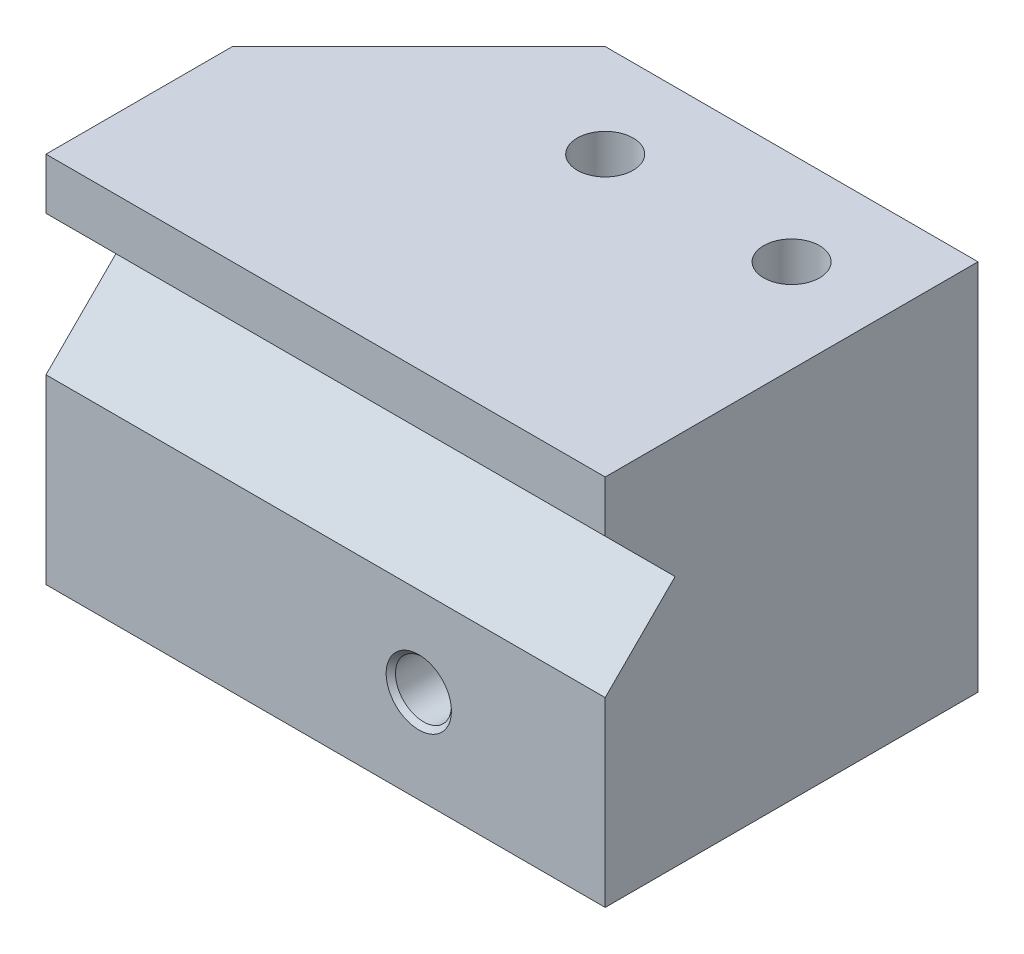
ISO-10303-21;
HEADER;
FILE_DESCRIPTION(('STEP AP214'),'2;1');
FILE_NAME('part.step','',(''),(''),'','','');
FILE_SCHEMA(('AUTOMOTIVE_DESIGN { 1 0 10303 214 1 1 1 1 }'));
ENDSEC;
DATA;
#1=APPLICATION_CONTEXT('core data for automotive mechanical design processes');
#2=APPLICATION_PROTOCOL_DEFINITION('international standard','automotive_design',2000,#1);
#3=PRODUCT_CONTEXT('',#1,'mechanical');
#4=PRODUCT('Part','Part','',(#3));
#5=PRODUCT_RELATED_PRODUCT_CATEGORY('part','',(#4));
#6=PRODUCT_DEFINITION_FORMATION('','',#4);
#7=PRODUCT_DEFINITION_CONTEXT('part definition',#1,'design');
#8=PRODUCT_DEFINITION('design','',#6,#7);
#9=PRODUCT_DEFINITION_SHAPE('','',#8);
#10=(LENGTH_UNIT() NAMED_UNIT(*) SI_UNIT(.MILLI.,.METRE.));
#11=(NAMED_UNIT(*) PLANE_ANGLE_UNIT() SI_UNIT($,.RADIAN.));
#12=(NAMED_UNIT(*) SI_UNIT($,.STERADIAN.) SOLID_ANGLE_UNIT());
#13=UNCERTAINTY_MEASURE_WITH_UNIT(LENGTH_MEASURE(1.E-05),#10,'distance_accuracy_value','');
#14=(GEOMETRIC_REPRESENTATION_CONTEXT(3) GLOBAL_UNCERTAINTY_ASSIGNED_CONTEXT((#13)) GLOBAL_UNIT_ASSIGNED_CONTEXT((#10,
#11,#12)) REPRESENTATION_CONTEXT('',''));
#15=CARTESIAN_POINT('',(0.,0.,0.));
#16=DIRECTION('',(0.,0.,1.));
#17=DIRECTION('',(1.,0.,0.));
#18=AXIS2_PLACEMENT_3D('',#15,#16,#17);
#19=CARTESIAN_POINT('',(15.,-10.,20.));
#20=DIRECTION('',(-1.,0.,0.));
#21=DIRECTION('',(0.,0.,1.));
#22=AXIS2_PLACEMENT_3D('',#19,#20,#21);
#23=PLANE('',#22);
#24=DIRECTION('',(0.,0.707106781186548,0.707106781186548));
#25=VECTOR('',#24,1.);
#26=CARTESIAN_POINT('',(15.,-1.375,11.375));
#27=LINE('',#26,#25);
#28=CARTESIAN_POINT('',(15.,3.5,16.25));
#29=VERTEX_POINT('',#28);
#30=CARTESIAN_POINT('',(15.,7.25,20.));
#31=VERTEX_POINT('',#30);
#32=EDGE_CURVE('E111',#29,#31,#27,.T.);
#33=ORIENTED_EDGE('',*,*,#32,.F.);
#34=DIRECTION('',(0.,0.707106781186548,-0.707106781186548));
#35=VECTOR('',#34,1.);
#36=CARTESIAN_POINT('',(15.,-5.125,24.875));
#37=LINE('',#36,#35);
#38=CARTESIAN_POINT('',(15.,-0.250000000000002,20.));
#39=VERTEX_POINT('',#38);
#40=EDGE_CURVE('E108',#39,#29,#37,.T.);
#41=ORIENTED_EDGE('',*,*,#40,.F.);
#42=DIRECTION('',(0.,1.,0.));
#43=VECTOR('',#42,1.);
#44=CARTESIAN_POINT('',(15.,-10.,20.));
#45=LINE('',#44,#43);
#46=CARTESIAN_POINT('',(15.,-10.,20.));
#47=VERTEX_POINT('',#46);
#48=EDGE_CURVE('E93',#47,#39,#45,.T.);
#49=ORIENTED_EDGE('',*,*,#48,.F.);
#50=DIRECTION('',(0.,0.,-1.));
#51=VECTOR('',#50,1.);
#52=CARTESIAN_POINT('',(15.,-10.,20.));
#53=LINE('',#52,#51);
#54=CARTESIAN_POINT('',(15.,-10.,0.));
#55=VERTEX_POINT('',#54);
#56=EDGE_CURVE('E144',#47,#55,#53,.T.);
#57=ORIENTED_EDGE('',*,*,#56,.T.);
#58=DIRECTION('',(0.,1.,0.));
#59=VECTOR('',#58,1.);
#60=CARTESIAN_POINT('',(15.,-10.,0.));
#61=LINE('',#60,#59);
#62=CARTESIAN_POINT('',(15.,10.,0.));
#63=VERTEX_POINT('',#62);
#64=EDGE_CURVE('E152',#55,#63,#61,.T.);
#65=ORIENTED_EDGE('',*,*,#64,.T.);
#66=DIRECTION('',(0.,0.,-1.));
#67=VECTOR('',#66,1.);
#68=CARTESIAN_POINT('',(15.,10.,20.));
#69=LINE('',#68,#67);
#70=CARTESIAN_POINT('',(15.,10.,20.));
#71=VERTEX_POINT('',#70);
#72=EDGE_CURVE('E121',#71,#63,#69,.T.);
#73=ORIENTED_EDGE('',*,*,#72,.F.);
#74=EDGE_CURVE('E105',#31,#71,#45,.T.);
#75=ORIENTED_EDGE('',*,*,#74,.F.);
#76=EDGE_LOOP('',(#33,#41,#49,#57,#65,#73,#75));
#77=FACE_BOUND('',#76,.T.);
#78=ADVANCED_FACE('F31',(#77),#23,.F.);
#79=CARTESIAN_POINT('',(-15.,-10.,20.));
#80=DIRECTION('',(1.,0.,0.));
#81=DIRECTION('',(0.,0.,-1.));
#82=AXIS2_PLACEMENT_3D('',#79,#80,#81);
#83=PLANE('',#82);
#84=DIRECTION('',(0.,0.,-1.));
#85=VECTOR('',#84,1.);
#86=CARTESIAN_POINT('',(-15.,10.,20.));
#87=LINE('',#86,#85);
#88=CARTESIAN_POINT('',(-15.,10.,20.));
#89=VERTEX_POINT('',#88);
#90=CARTESIAN_POINT('',(-15.,10.,9.99999999999999));
#91=VERTEX_POINT('',#90);
#92=EDGE_CURVE('E127',#89,#91,#87,.T.);
#93=ORIENTED_EDGE('',*,*,#92,.T.);
#94=DIRECTION('',(0.,-1.,0.));
#95=VECTOR('',#94,1.);
#96=CARTESIAN_POINT('',(-15.,-10.,9.99999999999999));
#97=LINE('',#96,#95);
#98=CARTESIAN_POINT('',(-15.,-10.,9.99999999999999));
#99=VERTEX_POINT('',#98);
#100=EDGE_CURVE('E124',#91,#99,#97,.T.);
#101=ORIENTED_EDGE('',*,*,#100,.T.);
#102=DIRECTION('',(0.,0.,-1.));
#103=VECTOR('',#102,1.);
#104=CARTESIAN_POINT('',(-15.,-10.,20.));
#105=LINE('',#104,#103);
#106=CARTESIAN_POINT('',(-15.,-10.,20.));
#107=VERTEX_POINT('',#106);
#108=EDGE_CURVE('E138',#107,#99,#105,.T.);
#109=ORIENTED_EDGE('',*,*,#108,.F.);
#110=DIRECTION('',(0.,-1.,0.));
#111=VECTOR('',#110,1.);
#112=CARTESIAN_POINT('',(-15.,-10.,20.));
#113=LINE('',#112,#111);
#114=CARTESIAN_POINT('',(-15.,-0.250000000000002,20.));
#115=VERTEX_POINT('',#114);
#116=EDGE_CURVE('E159',#115,#107,#113,.T.);
#117=ORIENTED_EDGE('',*,*,#116,.F.);
#118=DIRECTION('',(0.,-0.707106781186548,0.707106781186548));
#119=VECTOR('',#118,1.);
#120=CARTESIAN_POINT('',(-15.,-5.125,24.875));
#121=LINE('',#120,#119);
#122=CARTESIAN_POINT('',(-15.,3.5,16.25));
#123=VERTEX_POINT('',#122);
#124=EDGE_CURVE('E116',#123,#115,#121,.T.);
#125=ORIENTED_EDGE('',*,*,#124,.F.);
#126=DIRECTION('',(0.,-0.707106781186548,-0.707106781186548));
#127=VECTOR('',#126,1.);
#128=CARTESIAN_POINT('',(-15.,-1.375,11.375));
#129=LINE('',#128,#127);
#130=CARTESIAN_POINT('',(-15.,7.25,20.));
#131=VERTEX_POINT('',#130);
#132=EDGE_CURVE('E115',#131,#123,#129,.T.);
#133=ORIENTED_EDGE('',*,*,#132,.F.);
#134=EDGE_CURVE('E156',#89,#131,#113,.T.);
#135=ORIENTED_EDGE('',*,*,#134,.F.);
#136=EDGE_LOOP('',(#93,#101,#109,#117,#125,#133,#135));
#137=FACE_BOUND('',#136,.T.);
#138=ADVANCED_FACE('F137',(#137),#83,.F.);
#139=CARTESIAN_POINT('',(15.,10.,20.));
#140=DIRECTION('',(0.,0.,-1.));
#141=DIRECTION('',(-1.,0.,0.));
#142=AXIS2_PLACEMENT_3D('',#139,#140,#141);
#143=PLANE('',#142);
#144=DIRECTION('',(-1.,0.,0.));
#145=VECTOR('',#144,1.);
#146=CARTESIAN_POINT('',(15.,7.25,20.));
#147=LINE('',#146,#145);
#148=EDGE_CURVE('E120',#31,#131,#147,.T.);
#149=ORIENTED_EDGE('',*,*,#148,.F.);
#150=ORIENTED_EDGE('',*,*,#74,.T.);
#151=DIRECTION('',(-1.,0.,0.));
#152=VECTOR('',#151,1.);
#153=CARTESIAN_POINT('',(-15.,10.,20.));
#154=LINE('',#153,#152);
#155=EDGE_CURVE('E104',#71,#89,#154,.T.);
#156=ORIENTED_EDGE('',*,*,#155,.T.);
#157=ORIENTED_EDGE('',*,*,#134,.T.);
#158=EDGE_LOOP('',(#149,#150,#156,#157));
#159=FACE_BOUND('',#158,.T.);
#160=ADVANCED_FACE('F196',(#159),#143,.F.);
#161=CARTESIAN_POINT('',(5.,-5.,20.));
#162=DIRECTION('',(0.,0.,1.));
#163=DIRECTION('',(1.,0.,0.));
#164=AXIS2_PLACEMENT_3D('',#161,#162,#163);
#165=CIRCLE('',#164,1.75);
#166=CARTESIAN_POINT('',(6.75,-5.,20.));
#167=VERTEX_POINT('',#166);
#168=EDGE_CURVE('E188',#167,#167,#165,.T.);
#169=ORIENTED_EDGE('',*,*,#168,.F.);
#170=EDGE_LOOP('',(#169));
#171=FACE_BOUND('',#170,.T.);
#172=DIRECTION('',(1.,0.,0.));
#173=VECTOR('',#172,1.);
#174=CARTESIAN_POINT('',(15.,-0.250000000000002,20.));
#175=LINE('',#174,#173);
#176=EDGE_CURVE('E97',#115,#39,#175,.T.);
#177=ORIENTED_EDGE('',*,*,#176,.F.);
#178=ORIENTED_EDGE('',*,*,#116,.T.);
#179=DIRECTION('',(1.,0.,0.));
#180=VECTOR('',#179,1.);
#181=CARTESIAN_POINT('',(-15.,-10.,20.));
#182=LINE('',#181,#180);
#183=EDGE_CURVE('E100',#107,#47,#182,.T.);
#184=ORIENTED_EDGE('',*,*,#183,.T.);
#185=ORIENTED_EDGE('',*,*,#48,.T.);
#186=EDGE_LOOP('',(#177,#178,#184,#185));
#187=FACE_BOUND('',#186,.T.);
#188=ADVANCED_FACE('F95',(#171,#187),#143,.F.);
#189=CARTESIAN_POINT('',(-15.,10.,20.));
#190=DIRECTION('',(0.,-1.,0.));
#191=DIRECTION('',(0.,0.,-1.));
#192=AXIS2_PLACEMENT_3D('',#189,#190,#191);
#193=PLANE('',#192);
#194=CARTESIAN_POINT('',(0.,10.,5.));
#195=DIRECTION('',(0.,1.,0.));
#196=DIRECTION('',(0.,0.,1.));
#197=AXIS2_PLACEMENT_3D('',#194,#195,#196);
#198=CIRCLE('',#197,1.5);
#199=CARTESIAN_POINT('',(0.,10.,6.5));
#200=VERTEX_POINT('',#199);
#201=EDGE_CURVE('E174',#200,#200,#198,.T.);
#202=ORIENTED_EDGE('',*,*,#201,.F.);
#203=EDGE_LOOP('',(#202));
#204=FACE_BOUND('',#203,.T.);
#205=CARTESIAN_POINT('',(10.,10.,5.));
#206=DIRECTION('',(0.,1.,0.));
#207=DIRECTION('',(0.,0.,1.));
#208=AXIS2_PLACEMENT_3D('',#205,#206,#207);
#209=CIRCLE('',#208,1.5);
#210=CARTESIAN_POINT('',(10.,10.,6.5));
#211=VERTEX_POINT('',#210);
#212=EDGE_CURVE('E168',#211,#211,#209,.T.);
#213=ORIENTED_EDGE('',*,*,#212,.F.);
#214=EDGE_LOOP('',(#213));
#215=FACE_BOUND('',#214,.T.);
#216=DIRECTION('',(-1.,0.,0.));
#217=VECTOR('',#216,1.);
#218=CARTESIAN_POINT('',(-15.,10.,0.));
#219=LINE('',#218,#217);
#220=CARTESIAN_POINT('',(-4.99999999999996,10.,0.));
#221=VERTEX_POINT('',#220);
#222=EDGE_CURVE('E150',#63,#221,#219,.T.);
#223=ORIENTED_EDGE('',*,*,#222,.T.);
#224=DIRECTION('',(-0.707106781186549,0.,0.707106781186546));
#225=VECTOR('',#224,1.);
#226=CARTESIAN_POINT('',(-15.,10.,9.99999999999999));
#227=LINE('',#226,#225);
#228=EDGE_CURVE('E11',#221,#91,#227,.T.);
#229=ORIENTED_EDGE('',*,*,#228,.T.);
#230=ORIENTED_EDGE('',*,*,#92,.F.);
#231=ORIENTED_EDGE('',*,*,#155,.F.);
#232=ORIENTED_EDGE('',*,*,#72,.T.);
#233=EDGE_LOOP('',(#223,#229,#230,#231,#232));
#234=FACE_BOUND('',#233,.T.);
#235=ADVANCED_FACE('F195',(#204,#215,#234),#193,.F.);
#236=CARTESIAN_POINT('',(-15.,-10.,20.));
#237=DIRECTION('',(0.,1.,0.));
#238=DIRECTION('',(0.,0.,1.));
#239=AXIS2_PLACEMENT_3D('',#236,#237,#238);
#240=PLANE('',#239);
#241=CARTESIAN_POINT('',(0.,-10.,5.));
#242=DIRECTION('',(0.,1.,0.));
#243=DIRECTION('',(0.,0.,1.));
#244=AXIS2_PLACEMENT_3D('',#241,#242,#243);
#245=CIRCLE('',#244,1.5);
#246=CARTESIAN_POINT('',(0.,-10.,6.5));
#247=VERTEX_POINT('',#246);
#248=EDGE_CURVE('E171',#247,#247,#245,.T.);
#249=ORIENTED_EDGE('',*,*,#248,.T.);
#250=EDGE_LOOP('',(#249));
#251=FACE_BOUND('',#250,.T.);
#252=CARTESIAN_POINT('',(10.,-10.,5.));
#253=DIRECTION('',(0.,1.,0.));
#254=DIRECTION('',(0.,0.,1.));
#255=AXIS2_PLACEMENT_3D('',#252,#253,#254);
#256=CIRCLE('',#255,1.5);
#257=CARTESIAN_POINT('',(10.,-10.,6.5));
#258=VERTEX_POINT('',#257);
#259=EDGE_CURVE('E167',#258,#258,#256,.T.);
#260=ORIENTED_EDGE('',*,*,#259,.T.);
#261=EDGE_LOOP('',(#260));
#262=FACE_BOUND('',#261,.T.);
#263=ORIENTED_EDGE('',*,*,#108,.T.);
#264=DIRECTION('',(0.707106781186549,0.,-0.707106781186546));
#265=VECTOR('',#264,1.);
#266=CARTESIAN_POINT('',(-15.,-10.,9.99999999999999));
#267=LINE('',#266,#265);
#268=CARTESIAN_POINT('',(-4.99999999999996,-10.,0.));
#269=VERTEX_POINT('',#268);
#270=EDGE_CURVE('E53',#99,#269,#267,.T.);
#271=ORIENTED_EDGE('',*,*,#270,.T.);
#272=DIRECTION('',(1.,0.,0.));
#273=VECTOR('',#272,1.);
#274=CARTESIAN_POINT('',(-15.,-10.,0.));
#275=LINE('',#274,#273);
#276=EDGE_CURVE('E148',#269,#55,#275,.T.);
#277=ORIENTED_EDGE('',*,*,#276,.T.);
#278=ORIENTED_EDGE('',*,*,#56,.F.);
#279=ORIENTED_EDGE('',*,*,#183,.F.);
#280=EDGE_LOOP('',(#263,#271,#277,#278,#279));
#281=FACE_BOUND('',#280,.T.);
#282=ADVANCED_FACE('F143',(#251,#262,#281),#240,.F.);
#283=CARTESIAN_POINT('',(15.,10.,0.));
#284=DIRECTION('',(0.,0.,-1.));
#285=DIRECTION('',(-1.,0.,0.));
#286=AXIS2_PLACEMENT_3D('',#283,#284,#285);
#287=PLANE('',#286);
#288=CARTESIAN_POINT('',(5.,-5.,0.));
#289=DIRECTION('',(0.,0.,1.));
#290=DIRECTION('',(1.,0.,0.));
#291=AXIS2_PLACEMENT_3D('',#288,#289,#290);
#292=CIRCLE('',#291,1.75);
#293=CARTESIAN_POINT('',(6.75,-5.,0.));
#294=VERTEX_POINT('',#293);
#295=EDGE_CURVE('E177',#294,#294,#292,.T.);
#296=ORIENTED_EDGE('',*,*,#295,.T.);
#297=EDGE_LOOP('',(#296));
#298=FACE_BOUND('',#297,.T.);
#299=ORIENTED_EDGE('',*,*,#276,.F.);
#300=DIRECTION('',(0.,1.,0.));
#301=VECTOR('',#300,1.);
#302=CARTESIAN_POINT('',(-4.99999999999996,10.,0.));
#303=LINE('',#302,#301);
#304=EDGE_CURVE('E39',#269,#221,#303,.T.);
#305=ORIENTED_EDGE('',*,*,#304,.T.);
#306=ORIENTED_EDGE('',*,*,#222,.F.);
#307=ORIENTED_EDGE('',*,*,#64,.F.);
#308=EDGE_LOOP('',(#299,#305,#306,#307));
#309=FACE_BOUND('',#308,.T.);
#310=ADVANCED_FACE('F216',(#298,#309),#287,.T.);
#311=CARTESIAN_POINT('',(-104.038820320221,7.25,20.));
#312=DIRECTION('',(0.,-0.707106781186548,0.707106781186548));
#313=DIRECTION('',(0.,-0.707106781186548,-0.707106781186548));
#314=AXIS2_PLACEMENT_3D('',#311,#312,#313);
#315=PLANE('',#314);
#316=DIRECTION('',(1.,0.,0.));
#317=VECTOR('',#316,1.);
#318=CARTESIAN_POINT('',(-104.038820320221,3.5,16.25));
#319=LINE('',#318,#317);
#320=EDGE_CURVE('E165',#123,#29,#319,.T.);
#321=ORIENTED_EDGE('',*,*,#320,.T.);
#322=ORIENTED_EDGE('',*,*,#32,.T.);
#323=ORIENTED_EDGE('',*,*,#148,.T.);
#324=ORIENTED_EDGE('',*,*,#132,.T.);
#325=EDGE_LOOP('',(#321,#322,#323,#324));
#326=FACE_BOUND('',#325,.T.);
#327=ADVANCED_FACE('F218',(#326),#315,.T.);
#328=CARTESIAN_POINT('',(-104.038820320221,3.5,16.25));
#329=DIRECTION('',(0.,0.707106781186548,0.707106781186548));
#330=DIRECTION('',(0.,-0.707106781186548,0.707106781186548));
#331=AXIS2_PLACEMENT_3D('',#328,#329,#330);
#332=PLANE('',#331);
#333=ORIENTED_EDGE('',*,*,#176,.T.);
#334=ORIENTED_EDGE('',*,*,#40,.T.);
#335=ORIENTED_EDGE('',*,*,#320,.F.);
#336=ORIENTED_EDGE('',*,*,#124,.T.);
#337=EDGE_LOOP('',(#333,#334,#335,#336));
#338=FACE_BOUND('',#337,.T.);
#339=ADVANCED_FACE('F119',(#338),#332,.T.);
#340=CARTESIAN_POINT('',(10.,-10.,5.));
#341=DIRECTION('',(0.,1.,0.));
#342=DIRECTION('',(0.,0.,1.));
#343=AXIS2_PLACEMENT_3D('',#340,#341,#342);
#344=CYLINDRICAL_SURFACE('',#343,1.5);
#345=ORIENTED_EDGE('',*,*,#259,.F.);
#346=EDGE_LOOP('',(#345));
#347=FACE_BOUND('',#346,.T.);
#348=ORIENTED_EDGE('',*,*,#212,.T.);
#349=EDGE_LOOP('',(#348));
#350=FACE_BOUND('',#349,.T.);
#351=ADVANCED_FACE('F239',(#347,#350),#344,.F.);
#352=CARTESIAN_POINT('',(0.,-10.,5.));
#353=DIRECTION('',(0.,1.,0.));
#354=DIRECTION('',(0.,0.,1.));
#355=AXIS2_PLACEMENT_3D('',#352,#353,#354);
#356=CYLINDRICAL_SURFACE('',#355,1.5);
#357=ORIENTED_EDGE('',*,*,#248,.F.);
#358=EDGE_LOOP('',(#357));
#359=FACE_BOUND('',#358,.T.);
#360=ORIENTED_EDGE('',*,*,#201,.T.);
#361=EDGE_LOOP('',(#360));
#362=FACE_BOUND('',#361,.T.);
#363=ADVANCED_FACE('F232',(#359,#362),#356,.F.);
#364=CARTESIAN_POINT('',(-15.,-10.,9.99999999999999));
#365=DIRECTION('',(-0.707106781186546,0.,-0.707106781186549));
#366=DIRECTION('',(-0.707106781186549,0.,0.707106781186546));
#367=AXIS2_PLACEMENT_3D('',#364,#365,#366);
#368=PLANE('',#367);
#369=ORIENTED_EDGE('',*,*,#228,.F.);
#370=ORIENTED_EDGE('',*,*,#304,.F.);
#371=ORIENTED_EDGE('',*,*,#270,.F.);
#372=ORIENTED_EDGE('',*,*,#100,.F.);
#373=EDGE_LOOP('',(#369,#370,#371,#372));
#374=FACE_BOUND('',#373,.T.);
#375=ADVANCED_FACE('F33',(#374),#368,.T.);
#376=CARTESIAN_POINT('',(5.,-5.,0.25));
#377=DIRECTION('',(0.,0.,-1.));
#378=DIRECTION('',(-1.,0.,0.));
#379=AXIS2_PLACEMENT_3D('',#376,#377,#378);
#380=CONICAL_SURFACE('',#379,1.5,0.785398163397448);
#381=ORIENTED_EDGE('',*,*,#295,.F.);
#382=EDGE_LOOP('',(#381));
#383=FACE_BOUND('',#382,.T.);
#384=CARTESIAN_POINT('',(5.,-5.,0.25));
#385=DIRECTION('',(0.,0.,1.));
#386=DIRECTION('',(1.,0.,0.));
#387=AXIS2_PLACEMENT_3D('',#384,#385,#386);
#388=CIRCLE('',#387,1.5);
#389=CARTESIAN_POINT('',(6.5,-5.,0.25));
#390=VERTEX_POINT('',#389);
#391=EDGE_CURVE('E182',#390,#390,#388,.T.);
#392=ORIENTED_EDGE('',*,*,#391,.T.);
#393=EDGE_LOOP('',(#392));
#394=FACE_BOUND('',#393,.T.);
#395=ADVANCED_FACE('F231',(#383,#394),#380,.F.);
#396=CARTESIAN_POINT('',(5.,-5.,20.));
#397=DIRECTION('',(0.,0.,1.));
#398=DIRECTION('',(1.,0.,0.));
#399=AXIS2_PLACEMENT_3D('',#396,#397,#398);
#400=CYLINDRICAL_SURFACE('',#399,1.5);
#401=ORIENTED_EDGE('',*,*,#391,.F.);
#402=EDGE_LOOP('',(#401));
#403=FACE_BOUND('',#402,.T.);
#404=CARTESIAN_POINT('',(5.,-5.,19.75));
#405=DIRECTION('',(0.,0.,1.));
#406=DIRECTION('',(1.,0.,0.));
#407=AXIS2_PLACEMENT_3D('',#404,#405,#406);
#408=CIRCLE('',#407,1.5);
#409=CARTESIAN_POINT('',(6.5,-5.,19.75));
#410=VERTEX_POINT('',#409);
#411=EDGE_CURVE('E185',#410,#410,#408,.T.);
#412=ORIENTED_EDGE('',*,*,#411,.T.);
#413=EDGE_LOOP('',(#412));
#414=FACE_BOUND('',#413,.T.);
#415=ADVANCED_FACE('F236',(#403,#414),#400,.F.);
#416=CARTESIAN_POINT('',(5.,-5.,20.));
#417=DIRECTION('',(0.,0.,1.));
#418=DIRECTION('',(1.,0.,0.));
#419=AXIS2_PLACEMENT_3D('',#416,#417,#418);
#420=CONICAL_SURFACE('',#419,1.75,0.785398163397453);
#421=ORIENTED_EDGE('',*,*,#411,.F.);
#422=EDGE_LOOP('',(#421));
#423=FACE_BOUND('',#422,.T.);
#424=ORIENTED_EDGE('',*,*,#168,.T.);
#425=EDGE_LOOP('',(#424));
#426=FACE_BOUND('',#425,.T.);
#427=ADVANCED_FACE('F192',(#423,#426),#420,.F.);
#428=CLOSED_SHELL('',(#78,#138,#160,#188,#235,#282,#310,#327,#339,#351,#363,#375,#395,#415,#427));
#429=MANIFOLD_SOLID_BREP('B2',#428);
#430=ADVANCED_BREP_SHAPE_REPRESENTATION('',(#18,#429),#14);
#431=SHAPE_DEFINITION_REPRESENTATION(#9,#430);
ENDSEC;
END-ISO-10303-21;
